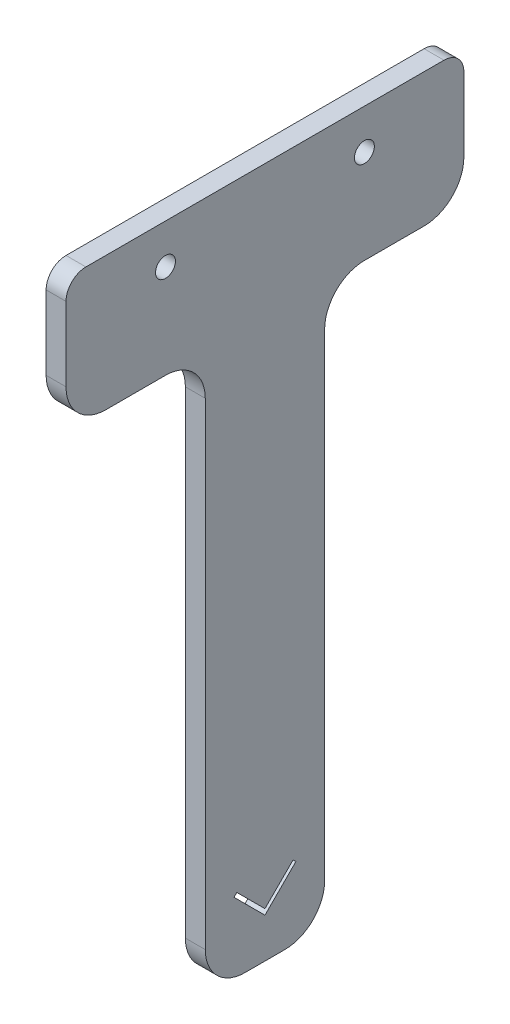
ISO-10303-21;
HEADER;
FILE_DESCRIPTION(('STEP AP214'),'2;1');
FILE_NAME('part.step','',(''),(''),'','','');
FILE_SCHEMA(('AUTOMOTIVE_DESIGN { 1 0 10303 214 1 1 1 1 }'));
ENDSEC;
DATA;
#1=APPLICATION_CONTEXT('core data for automotive mechanical design processes');
#2=APPLICATION_PROTOCOL_DEFINITION('international standard','automotive_design',2000,#1);
#3=PRODUCT_CONTEXT('',#1,'mechanical');
#4=PRODUCT('Part','Part','',(#3));
#5=PRODUCT_RELATED_PRODUCT_CATEGORY('part','',(#4));
#6=PRODUCT_DEFINITION_FORMATION('','',#4);
#7=PRODUCT_DEFINITION_CONTEXT('part definition',#1,'design');
#8=PRODUCT_DEFINITION('design','',#6,#7);
#9=PRODUCT_DEFINITION_SHAPE('','',#8);
#10=(LENGTH_UNIT() NAMED_UNIT(*) SI_UNIT(.MILLI.,.METRE.));
#11=(NAMED_UNIT(*) PLANE_ANGLE_UNIT() SI_UNIT($,.RADIAN.));
#12=(NAMED_UNIT(*) SI_UNIT($,.STERADIAN.) SOLID_ANGLE_UNIT());
#13=UNCERTAINTY_MEASURE_WITH_UNIT(LENGTH_MEASURE(1.E-05),#10,'distance_accuracy_value','');
#14=(GEOMETRIC_REPRESENTATION_CONTEXT(3) GLOBAL_UNCERTAINTY_ASSIGNED_CONTEXT((#13)) GLOBAL_UNIT_ASSIGNED_CONTEXT((#10,
#11,#12)) REPRESENTATION_CONTEXT('',''));
#15=CARTESIAN_POINT('',(0.,0.,0.));
#16=DIRECTION('',(0.,0.,1.));
#17=DIRECTION('',(1.,0.,0.));
#18=AXIS2_PLACEMENT_3D('',#15,#16,#17);
#19=CARTESIAN_POINT('',(6.35,-110.236,57.15));
#20=DIRECTION('',(0.,1.,0.));
#21=DIRECTION('',(0.,0.,1.));
#22=AXIS2_PLACEMENT_3D('',#19,#20,#21);
#23=PLANE('',#22);
#24=DIRECTION('',(0.,0.,-1.));
#25=VECTOR('',#24,1.);
#26=CARTESIAN_POINT('',(6.35,-110.236,57.15));
#27=LINE('',#26,#25);
#28=CARTESIAN_POINT('',(6.35,-110.236,6.34999999999992));
#29=VERTEX_POINT('',#28);
#30=CARTESIAN_POINT('',(6.35,-110.236,-6.34999999999991));
#31=VERTEX_POINT('',#30);
#32=EDGE_CURVE('E204',#29,#31,#27,.T.);
#33=ORIENTED_EDGE('',*,*,#32,.F.);
#34=DIRECTION('',(1.,0.,0.));
#35=VECTOR('',#34,1.);
#36=CARTESIAN_POINT('',(0.,-110.236,6.34999999999992));
#37=LINE('',#36,#35);
#38=CARTESIAN_POINT('',(0.,-110.236,6.34999999999992));
#39=VERTEX_POINT('',#38);
#40=EDGE_CURVE('E190',#39,#29,#37,.T.);
#41=ORIENTED_EDGE('',*,*,#40,.F.);
#42=DIRECTION('',(0.,0.,-1.));
#43=VECTOR('',#42,1.);
#44=CARTESIAN_POINT('',(0.,-110.236,57.15));
#45=LINE('',#44,#43);
#46=CARTESIAN_POINT('',(0.,-110.236,-6.34999999999991));
#47=VERTEX_POINT('',#46);
#48=EDGE_CURVE('E202',#39,#47,#45,.T.);
#49=ORIENTED_EDGE('',*,*,#48,.T.);
#50=DIRECTION('',(1.,0.,0.));
#51=VECTOR('',#50,1.);
#52=CARTESIAN_POINT('',(0.,-110.236,-6.34999999999991));
#53=LINE('',#52,#51);
#54=EDGE_CURVE('E382',#47,#31,#53,.T.);
#55=ORIENTED_EDGE('',*,*,#54,.T.);
#56=EDGE_LOOP('',(#33,#41,#49,#55));
#57=FACE_BOUND('',#56,.T.);
#58=ADVANCED_FACE('F38',(#57),#23,.F.);
#59=CARTESIAN_POINT('',(6.35,-103.886,63.5));
#60=DIRECTION('',(0.,0.,-1.));
#61=DIRECTION('',(-1.,0.,0.));
#62=AXIS2_PLACEMENT_3D('',#59,#60,#61);
#63=PLANE('',#62);
#64=DIRECTION('',(1.,0.,0.));
#65=VECTOR('',#64,1.);
#66=CARTESIAN_POINT('',(0.,80.2640000000001,63.5));
#67=LINE('',#66,#65);
#68=CARTESIAN_POINT('',(0.,80.2640000000001,63.5));
#69=VERTEX_POINT('',#68);
#70=CARTESIAN_POINT('',(6.35,80.2640000000001,63.5));
#71=VERTEX_POINT('',#70);
#72=EDGE_CURVE('E273',#69,#71,#67,.T.);
#73=ORIENTED_EDGE('',*,*,#72,.T.);
#74=DIRECTION('',(0.,-1.,0.));
#75=VECTOR('',#74,1.);
#76=CARTESIAN_POINT('',(6.35,-103.886,63.5));
#77=LINE('',#76,#75);
#78=CARTESIAN_POINT('',(6.35,103.886,63.5));
#79=VERTEX_POINT('',#78);
#80=EDGE_CURVE('E227',#79,#71,#77,.T.);
#81=ORIENTED_EDGE('',*,*,#80,.F.);
#82=DIRECTION('',(-1.,0.,0.));
#83=VECTOR('',#82,1.);
#84=CARTESIAN_POINT('',(6.35,103.886,63.5));
#85=LINE('',#84,#83);
#86=CARTESIAN_POINT('',(0.,103.886,63.5));
#87=VERTEX_POINT('',#86);
#88=EDGE_CURVE('E242',#79,#87,#85,.T.);
#89=ORIENTED_EDGE('',*,*,#88,.T.);
#90=DIRECTION('',(0.,-1.,0.));
#91=VECTOR('',#90,1.);
#92=CARTESIAN_POINT('',(0.,-103.886,63.5));
#93=LINE('',#92,#91);
#94=EDGE_CURVE('E238',#87,#69,#93,.T.);
#95=ORIENTED_EDGE('',*,*,#94,.T.);
#96=EDGE_LOOP('',(#73,#81,#89,#95));
#97=FACE_BOUND('',#96,.T.);
#98=ADVANCED_FACE('F271',(#97),#63,.F.);
#99=CARTESIAN_POINT('',(6.35,-103.886,-63.5));
#100=DIRECTION('',(0.,0.,1.));
#101=DIRECTION('',(1.,0.,0.));
#102=AXIS2_PLACEMENT_3D('',#99,#100,#101);
#103=PLANE('',#102);
#104=DIRECTION('',(0.,1.,0.));
#105=VECTOR('',#104,1.);
#106=CARTESIAN_POINT('',(6.35,-103.886,-63.5));
#107=LINE('',#106,#105);
#108=CARTESIAN_POINT('',(6.35,80.2640000000001,-63.5));
#109=VERTEX_POINT('',#108);
#110=CARTESIAN_POINT('',(6.35,103.886,-63.5));
#111=VERTEX_POINT('',#110);
#112=EDGE_CURVE('E285',#109,#111,#107,.T.);
#113=ORIENTED_EDGE('',*,*,#112,.F.);
#114=DIRECTION('',(1.,0.,0.));
#115=VECTOR('',#114,1.);
#116=CARTESIAN_POINT('',(0.,80.2640000000001,-63.5));
#117=LINE('',#116,#115);
#118=CARTESIAN_POINT('',(0.,80.2640000000001,-63.5));
#119=VERTEX_POINT('',#118);
#120=EDGE_CURVE('E367',#119,#109,#117,.T.);
#121=ORIENTED_EDGE('',*,*,#120,.F.);
#122=DIRECTION('',(0.,1.,0.));
#123=VECTOR('',#122,1.);
#124=CARTESIAN_POINT('',(0.,-103.886,-63.5));
#125=LINE('',#124,#123);
#126=CARTESIAN_POINT('',(0.,103.886,-63.5));
#127=VERTEX_POINT('',#126);
#128=EDGE_CURVE('E216',#119,#127,#125,.T.);
#129=ORIENTED_EDGE('',*,*,#128,.T.);
#130=DIRECTION('',(-1.,0.,0.));
#131=VECTOR('',#130,1.);
#132=CARTESIAN_POINT('',(6.35,103.886,-63.5));
#133=LINE('',#132,#131);
#134=EDGE_CURVE('E11',#111,#127,#133,.T.);
#135=ORIENTED_EDGE('',*,*,#134,.F.);
#136=EDGE_LOOP('',(#113,#121,#129,#135));
#137=FACE_BOUND('',#136,.T.);
#138=ADVANCED_FACE('F487',(#137),#103,.F.);
#139=CARTESIAN_POINT('',(6.35,103.886,-57.15));
#140=DIRECTION('',(-1.,0.,0.));
#141=DIRECTION('',(0.,0.,1.));
#142=AXIS2_PLACEMENT_3D('',#139,#140,#141);
#143=CYLINDRICAL_SURFACE('',#142,6.35);
#144=CARTESIAN_POINT('',(0.,103.886,-57.15));
#145=DIRECTION('',(1.,0.,0.));
#146=DIRECTION('',(0.,0.,-1.));
#147=AXIS2_PLACEMENT_3D('',#144,#145,#146);
#148=CIRCLE('',#147,6.35);
#149=CARTESIAN_POINT('',(0.,110.236,-57.15));
#150=VERTEX_POINT('',#149);
#151=EDGE_CURVE('E221',#127,#150,#148,.T.);
#152=ORIENTED_EDGE('',*,*,#151,.T.);
#153=DIRECTION('',(-1.,0.,0.));
#154=VECTOR('',#153,1.);
#155=CARTESIAN_POINT('',(6.35,110.236,-57.15));
#156=LINE('',#155,#154);
#157=CARTESIAN_POINT('',(6.35,110.236,-57.15));
#158=VERTEX_POINT('',#157);
#159=EDGE_CURVE('E46',#158,#150,#156,.T.);
#160=ORIENTED_EDGE('',*,*,#159,.F.);
#161=CARTESIAN_POINT('',(6.35,103.886,-57.15));
#162=DIRECTION('',(1.,0.,0.));
#163=DIRECTION('',(0.,0.,-1.));
#164=AXIS2_PLACEMENT_3D('',#161,#162,#163);
#165=CIRCLE('',#164,6.35);
#166=EDGE_CURVE('E280',#111,#158,#165,.T.);
#167=ORIENTED_EDGE('',*,*,#166,.F.);
#168=ORIENTED_EDGE('',*,*,#134,.T.);
#169=EDGE_LOOP('',(#152,#160,#167,#168));
#170=FACE_BOUND('',#169,.T.);
#171=ADVANCED_FACE('F492',(#170),#143,.T.);
#172=CARTESIAN_POINT('',(6.35,110.236,57.15));
#173=DIRECTION('',(0.,-1.,0.));
#174=DIRECTION('',(0.,0.,-1.));
#175=AXIS2_PLACEMENT_3D('',#172,#173,#174);
#176=PLANE('',#175);
#177=DIRECTION('',(0.,0.,1.));
#178=VECTOR('',#177,1.);
#179=CARTESIAN_POINT('',(0.,110.236,57.15));
#180=LINE('',#179,#178);
#181=CARTESIAN_POINT('',(0.,110.236,57.15));
#182=VERTEX_POINT('',#181);
#183=EDGE_CURVE('E232',#150,#182,#180,.T.);
#184=ORIENTED_EDGE('',*,*,#183,.T.);
#185=DIRECTION('',(-1.,0.,0.));
#186=VECTOR('',#185,1.);
#187=CARTESIAN_POINT('',(6.35,110.236,57.15));
#188=LINE('',#187,#186);
#189=CARTESIAN_POINT('',(6.35,110.236,57.15));
#190=VERTEX_POINT('',#189);
#191=EDGE_CURVE('E246',#190,#182,#188,.T.);
#192=ORIENTED_EDGE('',*,*,#191,.F.);
#193=DIRECTION('',(0.,0.,1.));
#194=VECTOR('',#193,1.);
#195=CARTESIAN_POINT('',(6.35,110.236,57.15));
#196=LINE('',#195,#194);
#197=EDGE_CURVE('E257',#158,#190,#196,.T.);
#198=ORIENTED_EDGE('',*,*,#197,.F.);
#199=ORIENTED_EDGE('',*,*,#159,.T.);
#200=EDGE_LOOP('',(#184,#192,#198,#199));
#201=FACE_BOUND('',#200,.T.);
#202=ADVANCED_FACE('F255',(#201),#176,.F.);
#203=CARTESIAN_POINT('',(6.35,103.886,57.15));
#204=DIRECTION('',(-1.,0.,0.));
#205=DIRECTION('',(0.,0.,1.));
#206=AXIS2_PLACEMENT_3D('',#203,#204,#205);
#207=CYLINDRICAL_SURFACE('',#206,6.35);
#208=CARTESIAN_POINT('',(0.,103.886,57.15));
#209=DIRECTION('',(1.,0.,0.));
#210=DIRECTION('',(0.,0.,1.));
#211=AXIS2_PLACEMENT_3D('',#208,#209,#210);
#212=CIRCLE('',#211,6.35);
#213=EDGE_CURVE('E235',#182,#87,#212,.T.);
#214=ORIENTED_EDGE('',*,*,#213,.T.);
#215=ORIENTED_EDGE('',*,*,#88,.F.);
#216=CARTESIAN_POINT('',(6.35,103.886,57.15));
#217=DIRECTION('',(1.,0.,0.));
#218=DIRECTION('',(0.,0.,1.));
#219=AXIS2_PLACEMENT_3D('',#216,#217,#218);
#220=CIRCLE('',#219,6.35);
#221=EDGE_CURVE('E277',#190,#79,#220,.T.);
#222=ORIENTED_EDGE('',*,*,#221,.F.);
#223=ORIENTED_EDGE('',*,*,#191,.T.);
#224=EDGE_LOOP('',(#214,#215,#222,#223));
#225=FACE_BOUND('',#224,.T.);
#226=ADVANCED_FACE('F266',(#225),#207,.T.);
#227=CARTESIAN_POINT('',(6.35,-103.886,57.15));
#228=DIRECTION('',(-1.,0.,0.));
#229=DIRECTION('',(0.,0.,1.));
#230=AXIS2_PLACEMENT_3D('',#227,#228,#229);
#231=PLANE('',#230);
#232=CARTESIAN_POINT('',(6.35,97.536,31.75));
#233=DIRECTION('',(-1.,0.,0.));
#234=DIRECTION('',(0.,0.,1.));
#235=AXIS2_PLACEMENT_3D('',#232,#233,#234);
#236=CIRCLE('',#235,3.175);
#237=CARTESIAN_POINT('',(6.35,97.536,34.925));
#238=VERTEX_POINT('',#237);
#239=EDGE_CURVE('E351',#238,#238,#236,.T.);
#240=ORIENTED_EDGE('',*,*,#239,.T.);
#241=EDGE_LOOP('',(#240));
#242=FACE_BOUND('',#241,.T.);
#243=CARTESIAN_POINT('',(6.35,97.536,-31.75));
#244=DIRECTION('',(-1.,0.,0.));
#245=DIRECTION('',(0.,0.,1.));
#246=AXIS2_PLACEMENT_3D('',#243,#244,#245);
#247=CIRCLE('',#246,3.175);
#248=CARTESIAN_POINT('',(6.35,97.536,-28.575));
#249=VERTEX_POINT('',#248);
#250=EDGE_CURVE('E355',#249,#249,#247,.T.);
#251=ORIENTED_EDGE('',*,*,#250,.T.);
#252=EDGE_LOOP('',(#251));
#253=FACE_BOUND('',#252,.T.);
#254=DIRECTION('',(0.,0.707106781186548,0.707106781186547));
#255=VECTOR('',#254,1.);
#256=CARTESIAN_POINT('',(6.35,-95.7399487757862,0.));
#257=LINE('',#256,#255);
#258=CARTESIAN_POINT('',(6.35,-95.7399487757862,0.));
#259=VERTEX_POINT('',#258);
#260=CARTESIAN_POINT('',(6.35,-86.759692654717,8.98025612106915));
#261=VERTEX_POINT('',#260);
#262=EDGE_CURVE('E324',#259,#261,#257,.T.);
#263=ORIENTED_EDGE('',*,*,#262,.F.);
#264=DIRECTION('',(0.,-0.707106781186546,0.707106781186549));
#265=VECTOR('',#264,1.);
#266=CARTESIAN_POINT('',(6.35,-86.759692654717,-8.98025612106917));
#267=LINE('',#266,#265);
#268=CARTESIAN_POINT('',(6.35,-86.759692654717,-8.98025612106917));
#269=VERTEX_POINT('',#268);
#270=EDGE_CURVE('E328',#269,#259,#267,.T.);
#271=ORIENTED_EDGE('',*,*,#270,.F.);
#272=DIRECTION('',(0.,0.70710678118655,0.707106781186545));
#273=VECTOR('',#272,1.);
#274=CARTESIAN_POINT('',(6.35,-87.6577182668239,-9.87828173317606));
#275=LINE('',#274,#273);
#276=CARTESIAN_POINT('',(6.35,-87.6577182668239,-9.87828173317606));
#277=VERTEX_POINT('',#276);
#278=EDGE_CURVE('E295',#277,#269,#275,.T.);
#279=ORIENTED_EDGE('',*,*,#278,.F.);
#280=DIRECTION('',(0.,0.707106781186547,-0.707106781186548));
#281=VECTOR('',#280,1.);
#282=CARTESIAN_POINT('',(6.35,-97.536,0.));
#283=LINE('',#282,#281);
#284=CARTESIAN_POINT('',(6.35,-97.536,0.));
#285=VERTEX_POINT('',#284);
#286=EDGE_CURVE('E312',#285,#277,#283,.T.);
#287=ORIENTED_EDGE('',*,*,#286,.F.);
#288=DIRECTION('',(0.,-0.707106781186547,-0.707106781186548));
#289=VECTOR('',#288,1.);
#290=CARTESIAN_POINT('',(6.35,-87.6577182668239,9.87828173317606));
#291=LINE('',#290,#289);
#292=CARTESIAN_POINT('',(6.35,-87.6577182668239,9.87828173317606));
#293=VERTEX_POINT('',#292);
#294=EDGE_CURVE('E316',#293,#285,#291,.T.);
#295=ORIENTED_EDGE('',*,*,#294,.F.);
#296=DIRECTION('',(0.,-0.707106781186556,0.707106781186539));
#297=VECTOR('',#296,1.);
#298=CARTESIAN_POINT('',(6.35,-86.759692654717,8.98025612106915));
#299=LINE('',#298,#297);
#300=EDGE_CURVE('E320',#261,#293,#299,.T.);
#301=ORIENTED_EDGE('',*,*,#300,.F.);
#302=EDGE_LOOP('',(#263,#271,#279,#287,#295,#301));
#303=FACE_BOUND('',#302,.T.);
#304=ORIENTED_EDGE('',*,*,#80,.T.);
#305=CARTESIAN_POINT('',(6.35,80.264,50.8));
#306=DIRECTION('',(-1.,0.,0.));
#307=DIRECTION('',(0.,0.,-1.));
#308=AXIS2_PLACEMENT_3D('',#305,#306,#307);
#309=CIRCLE('',#308,12.7);
#310=CARTESIAN_POINT('',(6.35,67.564,50.7999999999999));
#311=VERTEX_POINT('',#310);
#312=EDGE_CURVE('E196',#311,#71,#309,.T.);
#313=ORIENTED_EDGE('',*,*,#312,.F.);
#314=DIRECTION('',(0.,0.,1.));
#315=VECTOR('',#314,1.);
#316=CARTESIAN_POINT('',(6.35,67.564,31.7500000000001));
#317=LINE('',#316,#315);
#318=CARTESIAN_POINT('',(6.35,67.564,31.7500000000001));
#319=VERTEX_POINT('',#318);
#320=EDGE_CURVE('E435',#319,#311,#317,.T.);
#321=ORIENTED_EDGE('',*,*,#320,.F.);
#322=CARTESIAN_POINT('',(6.35,54.864,31.75));
#323=DIRECTION('',(1.,0.,0.));
#324=DIRECTION('',(0.,0.,-1.));
#325=AXIS2_PLACEMENT_3D('',#322,#323,#324);
#326=CIRCLE('',#325,12.7);
#327=CARTESIAN_POINT('',(6.35,54.8639999999999,19.05));
#328=VERTEX_POINT('',#327);
#329=EDGE_CURVE('E439',#328,#319,#326,.T.);
#330=ORIENTED_EDGE('',*,*,#329,.F.);
#331=DIRECTION('',(0.,1.,0.));
#332=VECTOR('',#331,1.);
#333=CARTESIAN_POINT('',(6.35,-97.5359999999999,19.05));
#334=LINE('',#333,#332);
#335=CARTESIAN_POINT('',(6.35,-97.5359999999999,19.05));
#336=VERTEX_POINT('',#335);
#337=EDGE_CURVE('E443',#336,#328,#334,.T.);
#338=ORIENTED_EDGE('',*,*,#337,.F.);
#339=CARTESIAN_POINT('',(6.35,-97.536,6.35));
#340=DIRECTION('',(-1.,0.,0.));
#341=DIRECTION('',(0.,0.,-1.));
#342=AXIS2_PLACEMENT_3D('',#339,#340,#341);
#343=CIRCLE('',#342,12.7);
#344=EDGE_CURVE('E385',#29,#336,#343,.T.);
#345=ORIENTED_EDGE('',*,*,#344,.F.);
#346=ORIENTED_EDGE('',*,*,#32,.T.);
#347=CARTESIAN_POINT('',(6.35,-97.536,-6.35));
#348=DIRECTION('',(-1.,0.,0.));
#349=DIRECTION('',(0.,0.,-1.));
#350=AXIS2_PLACEMENT_3D('',#347,#348,#349);
#351=CIRCLE('',#350,12.7);
#352=CARTESIAN_POINT('',(6.35,-97.536,-19.05));
#353=VERTEX_POINT('',#352);
#354=EDGE_CURVE('E386',#353,#31,#351,.T.);
#355=ORIENTED_EDGE('',*,*,#354,.F.);
#356=DIRECTION('',(0.,-1.,0.));
#357=VECTOR('',#356,1.);
#358=CARTESIAN_POINT('',(6.35,-97.5359999999999,-19.05));
#359=LINE('',#358,#357);
#360=CARTESIAN_POINT('',(6.35,54.8639999999999,-19.05));
#361=VERTEX_POINT('',#360);
#362=EDGE_CURVE('E390',#361,#353,#359,.T.);
#363=ORIENTED_EDGE('',*,*,#362,.F.);
#364=CARTESIAN_POINT('',(6.35,54.864,-31.75));
#365=DIRECTION('',(1.,0.,0.));
#366=DIRECTION('',(0.,0.,1.));
#367=AXIS2_PLACEMENT_3D('',#364,#365,#366);
#368=CIRCLE('',#367,12.7);
#369=CARTESIAN_POINT('',(6.35,67.564,-31.7500000000001));
#370=VERTEX_POINT('',#369);
#371=EDGE_CURVE('E394',#370,#361,#368,.T.);
#372=ORIENTED_EDGE('',*,*,#371,.F.);
#373=DIRECTION('',(0.,0.,1.));
#374=VECTOR('',#373,1.);
#375=CARTESIAN_POINT('',(6.35,67.564,-31.7500000000001));
#376=LINE('',#375,#374);
#377=CARTESIAN_POINT('',(6.35,67.564,-50.7999999999999));
#378=VERTEX_POINT('',#377);
#379=EDGE_CURVE('E398',#378,#370,#376,.T.);
#380=ORIENTED_EDGE('',*,*,#379,.F.);
#381=CARTESIAN_POINT('',(6.35,80.264,-50.8));
#382=DIRECTION('',(-1.,0.,0.));
#383=DIRECTION('',(0.,0.,1.));
#384=AXIS2_PLACEMENT_3D('',#381,#382,#383);
#385=CIRCLE('',#384,12.7);
#386=EDGE_CURVE('E402',#109,#378,#385,.T.);
#387=ORIENTED_EDGE('',*,*,#386,.F.);
#388=ORIENTED_EDGE('',*,*,#112,.T.);
#389=ORIENTED_EDGE('',*,*,#166,.T.);
#390=ORIENTED_EDGE('',*,*,#197,.T.);
#391=ORIENTED_EDGE('',*,*,#221,.T.);
#392=EDGE_LOOP('',(#304,#313,#321,#330,#338,#345,#346,#355,#363,#372,#380,#387,#388,#389,#390,#391));
#393=FACE_BOUND('',#392,.T.);
#394=ADVANCED_FACE('F471',(#242,#253,#303,#393),#231,.F.);
#395=CARTESIAN_POINT('',(0.,-103.886,57.15));
#396=DIRECTION('',(-1.,0.,0.));
#397=DIRECTION('',(0.,0.,1.));
#398=AXIS2_PLACEMENT_3D('',#395,#396,#397);
#399=PLANE('',#398);
#400=CARTESIAN_POINT('',(0.,80.264,50.8));
#401=DIRECTION('',(-1.,0.,0.));
#402=DIRECTION('',(0.,0.,-1.));
#403=AXIS2_PLACEMENT_3D('',#400,#401,#402);
#404=CIRCLE('',#403,12.7);
#405=CARTESIAN_POINT('',(0.,67.564,50.7999999999999));
#406=VERTEX_POINT('',#405);
#407=EDGE_CURVE('E206',#406,#69,#404,.T.);
#408=ORIENTED_EDGE('',*,*,#407,.T.);
#409=ORIENTED_EDGE('',*,*,#94,.F.);
#410=ORIENTED_EDGE('',*,*,#213,.F.);
#411=ORIENTED_EDGE('',*,*,#183,.F.);
#412=ORIENTED_EDGE('',*,*,#151,.F.);
#413=ORIENTED_EDGE('',*,*,#128,.F.);
#414=CARTESIAN_POINT('',(0.,80.264,-50.8));
#415=DIRECTION('',(-1.,0.,0.));
#416=DIRECTION('',(0.,0.,1.));
#417=AXIS2_PLACEMENT_3D('',#414,#415,#416);
#418=CIRCLE('',#417,12.7);
#419=CARTESIAN_POINT('',(0.,67.564,-50.7999999999999));
#420=VERTEX_POINT('',#419);
#421=EDGE_CURVE('E389',#119,#420,#418,.T.);
#422=ORIENTED_EDGE('',*,*,#421,.T.);
#423=DIRECTION('',(0.,0.,1.));
#424=VECTOR('',#423,1.);
#425=CARTESIAN_POINT('',(0.,67.564,-31.7500000000001));
#426=LINE('',#425,#424);
#427=CARTESIAN_POINT('',(0.,67.564,-31.7500000000001));
#428=VERTEX_POINT('',#427);
#429=EDGE_CURVE('E61',#420,#428,#426,.T.);
#430=ORIENTED_EDGE('',*,*,#429,.T.);
#431=CARTESIAN_POINT('',(0.,54.864,-31.75));
#432=DIRECTION('',(1.,0.,0.));
#433=DIRECTION('',(0.,0.,1.));
#434=AXIS2_PLACEMENT_3D('',#431,#432,#433);
#435=CIRCLE('',#434,12.7);
#436=CARTESIAN_POINT('',(0.,54.8639999999999,-19.05));
#437=VERTEX_POINT('',#436);
#438=EDGE_CURVE('E411',#428,#437,#435,.T.);
#439=ORIENTED_EDGE('',*,*,#438,.T.);
#440=DIRECTION('',(0.,-1.,0.));
#441=VECTOR('',#440,1.);
#442=CARTESIAN_POINT('',(0.,-97.5359999999999,-19.05));
#443=LINE('',#442,#441);
#444=CARTESIAN_POINT('',(0.,-97.536,-19.05));
#445=VERTEX_POINT('',#444);
#446=EDGE_CURVE('E408',#437,#445,#443,.T.);
#447=ORIENTED_EDGE('',*,*,#446,.T.);
#448=CARTESIAN_POINT('',(0.,-97.536,-6.35));
#449=DIRECTION('',(-1.,0.,0.));
#450=DIRECTION('',(0.,0.,-1.));
#451=AXIS2_PLACEMENT_3D('',#448,#449,#450);
#452=CIRCLE('',#451,12.7);
#453=EDGE_CURVE('E214',#445,#47,#452,.T.);
#454=ORIENTED_EDGE('',*,*,#453,.T.);
#455=ORIENTED_EDGE('',*,*,#48,.F.);
#456=CARTESIAN_POINT('',(0.,-97.536,6.35));
#457=DIRECTION('',(-1.,0.,0.));
#458=DIRECTION('',(0.,0.,-1.));
#459=AXIS2_PLACEMENT_3D('',#456,#457,#458);
#460=CIRCLE('',#459,12.7);
#461=CARTESIAN_POINT('',(0.,-97.536,19.05));
#462=VERTEX_POINT('',#461);
#463=EDGE_CURVE('E186',#39,#462,#460,.T.);
#464=ORIENTED_EDGE('',*,*,#463,.T.);
#465=DIRECTION('',(0.,1.,0.));
#466=VECTOR('',#465,1.);
#467=CARTESIAN_POINT('',(0.,-97.5359999999999,19.05));
#468=LINE('',#467,#466);
#469=CARTESIAN_POINT('',(0.,54.8639999999999,19.05));
#470=VERTEX_POINT('',#469);
#471=EDGE_CURVE('E53',#462,#470,#468,.T.);
#472=ORIENTED_EDGE('',*,*,#471,.T.);
#473=CARTESIAN_POINT('',(0.,54.864,31.75));
#474=DIRECTION('',(1.,0.,0.));
#475=DIRECTION('',(0.,0.,-1.));
#476=AXIS2_PLACEMENT_3D('',#473,#474,#475);
#477=CIRCLE('',#476,12.7);
#478=CARTESIAN_POINT('',(0.,67.564,31.7500000000001));
#479=VERTEX_POINT('',#478);
#480=EDGE_CURVE('E455',#470,#479,#477,.T.);
#481=ORIENTED_EDGE('',*,*,#480,.T.);
#482=DIRECTION('',(0.,0.,1.));
#483=VECTOR('',#482,1.);
#484=CARTESIAN_POINT('',(0.,67.564,31.7500000000001));
#485=LINE('',#484,#483);
#486=EDGE_CURVE('E451',#479,#406,#485,.T.);
#487=ORIENTED_EDGE('',*,*,#486,.T.);
#488=EDGE_LOOP('',(#408,#409,#410,#411,#412,#413,#422,#430,#439,#447,#454,#455,#464,#472,#481,#487));
#489=FACE_BOUND('',#488,.T.);
#490=CARTESIAN_POINT('',(0.,97.536,31.75));
#491=DIRECTION('',(1.,0.,0.));
#492=DIRECTION('',(0.,0.,-1.));
#493=AXIS2_PLACEMENT_3D('',#490,#491,#492);
#494=CIRCLE('',#493,3.175);
#495=CARTESIAN_POINT('',(0.,97.536,28.575));
#496=VERTEX_POINT('',#495);
#497=EDGE_CURVE('E359',#496,#496,#494,.T.);
#498=ORIENTED_EDGE('',*,*,#497,.T.);
#499=EDGE_LOOP('',(#498));
#500=FACE_BOUND('',#499,.T.);
#501=CARTESIAN_POINT('',(0.,97.536,-31.75));
#502=DIRECTION('',(1.,0.,0.));
#503=DIRECTION('',(0.,0.,-1.));
#504=AXIS2_PLACEMENT_3D('',#501,#502,#503);
#505=CIRCLE('',#504,3.175);
#506=CARTESIAN_POINT('',(0.,97.536,-34.925));
#507=VERTEX_POINT('',#506);
#508=EDGE_CURVE('E360',#507,#507,#505,.T.);
#509=ORIENTED_EDGE('',*,*,#508,.T.);
#510=EDGE_LOOP('',(#509));
#511=FACE_BOUND('',#510,.T.);
#512=DIRECTION('',(0.,-0.707106781186546,0.707106781186549));
#513=VECTOR('',#512,1.);
#514=CARTESIAN_POINT('',(0.,-86.759692654717,-8.98025612106917));
#515=LINE('',#514,#513);
#516=CARTESIAN_POINT('',(0.,-86.759692654717,-8.98025612106917));
#517=VERTEX_POINT('',#516);
#518=CARTESIAN_POINT('',(0.,-95.7399487757862,0.));
#519=VERTEX_POINT('',#518);
#520=EDGE_CURVE('E331',#517,#519,#515,.T.);
#521=ORIENTED_EDGE('',*,*,#520,.T.);
#522=DIRECTION('',(0.,0.707106781186548,0.707106781186547));
#523=VECTOR('',#522,1.);
#524=CARTESIAN_POINT('',(0.,-95.7399487757862,0.));
#525=LINE('',#524,#523);
#526=CARTESIAN_POINT('',(0.,-86.759692654717,8.98025612106914));
#527=VERTEX_POINT('',#526);
#528=EDGE_CURVE('E217',#519,#527,#525,.T.);
#529=ORIENTED_EDGE('',*,*,#528,.T.);
#530=DIRECTION('',(0.,-0.707106781186556,0.707106781186539));
#531=VECTOR('',#530,1.);
#532=CARTESIAN_POINT('',(0.,-86.759692654717,8.98025612106915));
#533=LINE('',#532,#531);
#534=CARTESIAN_POINT('',(0.,-87.6577182668239,9.87828173317606));
#535=VERTEX_POINT('',#534);
#536=EDGE_CURVE('E347',#527,#535,#533,.T.);
#537=ORIENTED_EDGE('',*,*,#536,.T.);
#538=DIRECTION('',(0.,-0.707106781186547,-0.707106781186548));
#539=VECTOR('',#538,1.);
#540=CARTESIAN_POINT('',(0.,-87.6577182668239,9.87828173317606));
#541=LINE('',#540,#539);
#542=CARTESIAN_POINT('',(0.,-97.536,0.));
#543=VERTEX_POINT('',#542);
#544=EDGE_CURVE('E343',#535,#543,#541,.T.);
#545=ORIENTED_EDGE('',*,*,#544,.T.);
#546=DIRECTION('',(0.,0.707106781186547,-0.707106781186548));
#547=VECTOR('',#546,1.);
#548=CARTESIAN_POINT('',(0.,-97.536,0.));
#549=LINE('',#548,#547);
#550=CARTESIAN_POINT('',(0.,-87.6577182668239,-9.87828173317606));
#551=VERTEX_POINT('',#550);
#552=EDGE_CURVE('E339',#543,#551,#549,.T.);
#553=ORIENTED_EDGE('',*,*,#552,.T.);
#554=DIRECTION('',(0.,0.70710678118655,0.707106781186545));
#555=VECTOR('',#554,1.);
#556=CARTESIAN_POINT('',(0.,-87.6577182668239,-9.87828173317606));
#557=LINE('',#556,#555);
#558=EDGE_CURVE('E335',#551,#517,#557,.T.);
#559=ORIENTED_EDGE('',*,*,#558,.T.);
#560=EDGE_LOOP('',(#521,#529,#537,#545,#553,#559));
#561=FACE_BOUND('',#560,.T.);
#562=ADVANCED_FACE('F210',(#489,#500,#511,#561),#399,.T.);
#563=CARTESIAN_POINT('',(-0.00100000000000013,-86.759692654717,-8.98025612106917));
#564=DIRECTION('',(0.,0.707106781186549,0.707106781186546));
#565=DIRECTION('',(0.,-0.707106781186546,0.707106781186549));
#566=AXIS2_PLACEMENT_3D('',#563,#564,#565);
#567=PLANE('',#566);
#568=DIRECTION('',(1.,0.,0.));
#569=VECTOR('',#568,1.);
#570=CARTESIAN_POINT('',(-0.00100000000000013,-86.759692654717,-8.98025612106917));
#571=LINE('',#570,#569);
#572=EDGE_CURVE('E224',#517,#269,#571,.T.);
#573=ORIENTED_EDGE('',*,*,#572,.T.);
#574=ORIENTED_EDGE('',*,*,#270,.T.);
#575=DIRECTION('',(1.,0.,0.));
#576=VECTOR('',#575,1.);
#577=CARTESIAN_POINT('',(-0.00100000000000013,-95.7399487757862,0.));
#578=LINE('',#577,#576);
#579=EDGE_CURVE('E290',#519,#259,#578,.T.);
#580=ORIENTED_EDGE('',*,*,#579,.F.);
#581=ORIENTED_EDGE('',*,*,#520,.F.);
#582=EDGE_LOOP('',(#573,#574,#580,#581));
#583=FACE_BOUND('',#582,.T.);
#584=ADVANCED_FACE('F551',(#583),#567,.F.);
#585=CARTESIAN_POINT('',(-0.00100000000000013,-87.6577182668239,-9.87828173317606));
#586=DIRECTION('',(0.,0.707106781186545,-0.70710678118655));
#587=DIRECTION('',(0.,0.70710678118655,0.707106781186545));
#588=AXIS2_PLACEMENT_3D('',#585,#586,#587);
#589=PLANE('',#588);
#590=DIRECTION('',(1.,0.,0.));
#591=VECTOR('',#590,1.);
#592=CARTESIAN_POINT('',(-0.00100000000000013,-87.6577182668239,-9.87828173317606));
#593=LINE('',#592,#591);
#594=EDGE_CURVE('E304',#551,#277,#593,.T.);
#595=ORIENTED_EDGE('',*,*,#594,.T.);
#596=ORIENTED_EDGE('',*,*,#278,.T.);
#597=ORIENTED_EDGE('',*,*,#572,.F.);
#598=ORIENTED_EDGE('',*,*,#558,.F.);
#599=EDGE_LOOP('',(#595,#596,#597,#598));
#600=FACE_BOUND('',#599,.T.);
#601=ADVANCED_FACE('F547',(#600),#589,.F.);
#602=CARTESIAN_POINT('',(-0.00100000000000013,-97.536,0.));
#603=DIRECTION('',(0.,-0.707106781186548,-0.707106781186547));
#604=DIRECTION('',(0.,0.707106781186547,-0.707106781186548));
#605=AXIS2_PLACEMENT_3D('',#602,#603,#604);
#606=PLANE('',#605);
#607=DIRECTION('',(1.,0.,0.));
#608=VECTOR('',#607,1.);
#609=CARTESIAN_POINT('',(-0.00100000000000013,-97.536,0.));
#610=LINE('',#609,#608);
#611=EDGE_CURVE('E301',#543,#285,#610,.T.);
#612=ORIENTED_EDGE('',*,*,#611,.T.);
#613=ORIENTED_EDGE('',*,*,#286,.T.);
#614=ORIENTED_EDGE('',*,*,#594,.F.);
#615=ORIENTED_EDGE('',*,*,#552,.F.);
#616=EDGE_LOOP('',(#612,#613,#614,#615));
#617=FACE_BOUND('',#616,.T.);
#618=ADVANCED_FACE('F550',(#617),#606,.F.);
#619=CARTESIAN_POINT('',(-0.00100000000000013,-87.6577182668239,9.87828173317606));
#620=DIRECTION('',(0.,-0.707106781186548,0.707106781186547));
#621=DIRECTION('',(0.,-0.707106781186547,-0.707106781186548));
#622=AXIS2_PLACEMENT_3D('',#619,#620,#621);
#623=PLANE('',#622);
#624=DIRECTION('',(1.,0.,0.));
#625=VECTOR('',#624,1.);
#626=CARTESIAN_POINT('',(-0.00100000000000013,-87.6577182668239,9.87828173317606));
#627=LINE('',#626,#625);
#628=EDGE_CURVE('E298',#535,#293,#627,.T.);
#629=ORIENTED_EDGE('',*,*,#628,.T.);
#630=ORIENTED_EDGE('',*,*,#294,.T.);
#631=ORIENTED_EDGE('',*,*,#611,.F.);
#632=ORIENTED_EDGE('',*,*,#544,.F.);
#633=EDGE_LOOP('',(#629,#630,#631,#632));
#634=FACE_BOUND('',#633,.T.);
#635=ADVANCED_FACE('F555',(#634),#623,.F.);
#636=CARTESIAN_POINT('',(-0.00100000000000013,-86.759692654717,8.98025612106915));
#637=DIRECTION('',(0.,0.707106781186539,0.707106781186556));
#638=DIRECTION('',(0.,-0.707106781186556,0.707106781186539));
#639=AXIS2_PLACEMENT_3D('',#636,#637,#638);
#640=PLANE('',#639);
#641=DIRECTION('',(1.,0.,0.));
#642=VECTOR('',#641,1.);
#643=CARTESIAN_POINT('',(-0.00100000000000013,-86.759692654717,8.98025612106915));
#644=LINE('',#643,#642);
#645=EDGE_CURVE('E294',#527,#261,#644,.T.);
#646=ORIENTED_EDGE('',*,*,#645,.T.);
#647=ORIENTED_EDGE('',*,*,#300,.T.);
#648=ORIENTED_EDGE('',*,*,#628,.F.);
#649=ORIENTED_EDGE('',*,*,#536,.F.);
#650=EDGE_LOOP('',(#646,#647,#648,#649));
#651=FACE_BOUND('',#650,.T.);
#652=ADVANCED_FACE('F559',(#651),#640,.F.);
#653=CARTESIAN_POINT('',(-0.00100000000000013,-95.7399487757862,0.));
#654=DIRECTION('',(0.,0.707106781186547,-0.707106781186548));
#655=DIRECTION('',(0.,0.707106781186548,0.707106781186547));
#656=AXIS2_PLACEMENT_3D('',#653,#654,#655);
#657=PLANE('',#656);
#658=ORIENTED_EDGE('',*,*,#579,.T.);
#659=ORIENTED_EDGE('',*,*,#262,.T.);
#660=ORIENTED_EDGE('',*,*,#645,.F.);
#661=ORIENTED_EDGE('',*,*,#528,.F.);
#662=EDGE_LOOP('',(#658,#659,#660,#661));
#663=FACE_BOUND('',#662,.T.);
#664=ADVANCED_FACE('F545',(#663),#657,.F.);
#665=CARTESIAN_POINT('',(0.,97.536,-31.75));
#666=DIRECTION('',(1.,0.,0.));
#667=DIRECTION('',(0.,0.,-1.));
#668=AXIS2_PLACEMENT_3D('',#665,#666,#667);
#669=CYLINDRICAL_SURFACE('',#668,3.175);
#670=ORIENTED_EDGE('',*,*,#508,.F.);
#671=EDGE_LOOP('',(#670));
#672=FACE_BOUND('',#671,.T.);
#673=ORIENTED_EDGE('',*,*,#250,.F.);
#674=EDGE_LOOP('',(#673));
#675=FACE_BOUND('',#674,.T.);
#676=ADVANCED_FACE('F533',(#672,#675),#669,.F.);
#677=CARTESIAN_POINT('',(0.,97.536,31.75));
#678=DIRECTION('',(1.,0.,0.));
#679=DIRECTION('',(0.,0.,-1.));
#680=AXIS2_PLACEMENT_3D('',#677,#678,#679);
#681=CYLINDRICAL_SURFACE('',#680,3.175);
#682=ORIENTED_EDGE('',*,*,#497,.F.);
#683=EDGE_LOOP('',(#682));
#684=FACE_BOUND('',#683,.T.);
#685=ORIENTED_EDGE('',*,*,#239,.F.);
#686=EDGE_LOOP('',(#685));
#687=FACE_BOUND('',#686,.T.);
#688=ADVANCED_FACE('F525',(#684,#687),#681,.F.);
#689=CARTESIAN_POINT('',(0.,-97.536,-6.35));
#690=DIRECTION('',(1.,0.,0.));
#691=DIRECTION('',(0.,0.,-1.));
#692=AXIS2_PLACEMENT_3D('',#689,#690,#691);
#693=CYLINDRICAL_SURFACE('',#692,12.7);
#694=ORIENTED_EDGE('',*,*,#354,.T.);
#695=ORIENTED_EDGE('',*,*,#54,.F.);
#696=ORIENTED_EDGE('',*,*,#453,.F.);
#697=DIRECTION('',(1.,0.,0.));
#698=VECTOR('',#697,1.);
#699=CARTESIAN_POINT('',(0.,-97.536,-19.05));
#700=LINE('',#699,#698);
#701=EDGE_CURVE('E379',#445,#353,#700,.T.);
#702=ORIENTED_EDGE('',*,*,#701,.T.);
#703=EDGE_LOOP('',(#694,#695,#696,#702));
#704=FACE_BOUND('',#703,.T.);
#705=ADVANCED_FACE('F523',(#704),#693,.T.);
#706=CARTESIAN_POINT('',(0.,-97.5359999999999,-19.05));
#707=DIRECTION('',(0.,0.,1.));
#708=DIRECTION('',(0.,-1.,0.));
#709=AXIS2_PLACEMENT_3D('',#706,#707,#708);
#710=PLANE('',#709);
#711=ORIENTED_EDGE('',*,*,#362,.T.);
#712=ORIENTED_EDGE('',*,*,#701,.F.);
#713=ORIENTED_EDGE('',*,*,#446,.F.);
#714=DIRECTION('',(1.,0.,0.));
#715=VECTOR('',#714,1.);
#716=CARTESIAN_POINT('',(0.,54.8639999999999,-19.05));
#717=LINE('',#716,#715);
#718=EDGE_CURVE('E376',#437,#361,#717,.T.);
#719=ORIENTED_EDGE('',*,*,#718,.T.);
#720=EDGE_LOOP('',(#711,#712,#713,#719));
#721=FACE_BOUND('',#720,.T.);
#722=ADVANCED_FACE('F521',(#721),#710,.F.);
#723=CARTESIAN_POINT('',(0.,54.864,-31.75));
#724=DIRECTION('',(1.,0.,0.));
#725=DIRECTION('',(0.,0.,-1.));
#726=AXIS2_PLACEMENT_3D('',#723,#724,#725);
#727=CYLINDRICAL_SURFACE('',#726,12.7);
#728=ORIENTED_EDGE('',*,*,#371,.T.);
#729=ORIENTED_EDGE('',*,*,#718,.F.);
#730=ORIENTED_EDGE('',*,*,#438,.F.);
#731=DIRECTION('',(1.,0.,0.));
#732=VECTOR('',#731,1.);
#733=CARTESIAN_POINT('',(0.,67.564,-31.7500000000001));
#734=LINE('',#733,#732);
#735=EDGE_CURVE('E373',#428,#370,#734,.T.);
#736=ORIENTED_EDGE('',*,*,#735,.T.);
#737=EDGE_LOOP('',(#728,#729,#730,#736));
#738=FACE_BOUND('',#737,.T.);
#739=ADVANCED_FACE('F518',(#738),#727,.F.);
#740=CARTESIAN_POINT('',(0.,67.564,-31.7500000000001));
#741=DIRECTION('',(0.,1.,0.));
#742=DIRECTION('',(0.,0.,1.));
#743=AXIS2_PLACEMENT_3D('',#740,#741,#742);
#744=PLANE('',#743);
#745=ORIENTED_EDGE('',*,*,#379,.T.);
#746=ORIENTED_EDGE('',*,*,#735,.F.);
#747=ORIENTED_EDGE('',*,*,#429,.F.);
#748=DIRECTION('',(1.,0.,0.));
#749=VECTOR('',#748,1.);
#750=CARTESIAN_POINT('',(0.,67.564,-50.7999999999999));
#751=LINE('',#750,#749);
#752=EDGE_CURVE('E370',#420,#378,#751,.T.);
#753=ORIENTED_EDGE('',*,*,#752,.T.);
#754=EDGE_LOOP('',(#745,#746,#747,#753));
#755=FACE_BOUND('',#754,.T.);
#756=ADVANCED_FACE('F512',(#755),#744,.F.);
#757=CARTESIAN_POINT('',(0.,80.264,-50.8));
#758=DIRECTION('',(1.,0.,0.));
#759=DIRECTION('',(0.,0.,-1.));
#760=AXIS2_PLACEMENT_3D('',#757,#758,#759);
#761=CYLINDRICAL_SURFACE('',#760,12.7);
#762=ORIENTED_EDGE('',*,*,#386,.T.);
#763=ORIENTED_EDGE('',*,*,#752,.F.);
#764=ORIENTED_EDGE('',*,*,#421,.F.);
#765=ORIENTED_EDGE('',*,*,#120,.T.);
#766=EDGE_LOOP('',(#762,#763,#764,#765));
#767=FACE_BOUND('',#766,.T.);
#768=ADVANCED_FACE('F509',(#767),#761,.T.);
#769=CARTESIAN_POINT('',(0.,80.264,50.8));
#770=DIRECTION('',(1.,0.,0.));
#771=DIRECTION('',(0.,0.,-1.));
#772=AXIS2_PLACEMENT_3D('',#769,#770,#771);
#773=CYLINDRICAL_SURFACE('',#772,12.7);
#774=ORIENTED_EDGE('',*,*,#312,.T.);
#775=ORIENTED_EDGE('',*,*,#72,.F.);
#776=ORIENTED_EDGE('',*,*,#407,.F.);
#777=DIRECTION('',(1.,0.,0.));
#778=VECTOR('',#777,1.);
#779=CARTESIAN_POINT('',(0.,67.564,50.7999999999999));
#780=LINE('',#779,#778);
#781=EDGE_CURVE('E428',#406,#311,#780,.T.);
#782=ORIENTED_EDGE('',*,*,#781,.T.);
#783=EDGE_LOOP('',(#774,#775,#776,#782));
#784=FACE_BOUND('',#783,.T.);
#785=ADVANCED_FACE('F470',(#784),#773,.T.);
#786=CARTESIAN_POINT('',(0.,67.564,31.7500000000001));
#787=DIRECTION('',(0.,1.,0.));
#788=DIRECTION('',(0.,0.,1.));
#789=AXIS2_PLACEMENT_3D('',#786,#787,#788);
#790=PLANE('',#789);
#791=ORIENTED_EDGE('',*,*,#320,.T.);
#792=ORIENTED_EDGE('',*,*,#781,.F.);
#793=ORIENTED_EDGE('',*,*,#486,.F.);
#794=DIRECTION('',(1.,0.,0.));
#795=VECTOR('',#794,1.);
#796=CARTESIAN_POINT('',(0.,67.564,31.7500000000001));
#797=LINE('',#796,#795);
#798=EDGE_CURVE('E425',#479,#319,#797,.T.);
#799=ORIENTED_EDGE('',*,*,#798,.T.);
#800=EDGE_LOOP('',(#791,#792,#793,#799));
#801=FACE_BOUND('',#800,.T.);
#802=ADVANCED_FACE('F467',(#801),#790,.F.);
#803=CARTESIAN_POINT('',(0.,54.864,31.75));
#804=DIRECTION('',(1.,0.,0.));
#805=DIRECTION('',(0.,0.,-1.));
#806=AXIS2_PLACEMENT_3D('',#803,#804,#805);
#807=CYLINDRICAL_SURFACE('',#806,12.7);
#808=ORIENTED_EDGE('',*,*,#329,.T.);
#809=ORIENTED_EDGE('',*,*,#798,.F.);
#810=ORIENTED_EDGE('',*,*,#480,.F.);
#811=DIRECTION('',(1.,0.,0.));
#812=VECTOR('',#811,1.);
#813=CARTESIAN_POINT('',(0.,54.8639999999999,19.05));
#814=LINE('',#813,#812);
#815=EDGE_CURVE('E422',#470,#328,#814,.T.);
#816=ORIENTED_EDGE('',*,*,#815,.T.);
#817=EDGE_LOOP('',(#808,#809,#810,#816));
#818=FACE_BOUND('',#817,.T.);
#819=ADVANCED_FACE('F463',(#818),#807,.F.);
#820=CARTESIAN_POINT('',(0.,-97.5359999999999,19.05));
#821=DIRECTION('',(0.,0.,-1.));
#822=DIRECTION('',(-1.,0.,0.));
#823=AXIS2_PLACEMENT_3D('',#820,#821,#822);
#824=PLANE('',#823);
#825=ORIENTED_EDGE('',*,*,#337,.T.);
#826=ORIENTED_EDGE('',*,*,#815,.F.);
#827=ORIENTED_EDGE('',*,*,#471,.F.);
#828=DIRECTION('',(1.,0.,0.));
#829=VECTOR('',#828,1.);
#830=CARTESIAN_POINT('',(0.,-97.5359999999999,19.05));
#831=LINE('',#830,#829);
#832=EDGE_CURVE('E192',#462,#336,#831,.T.);
#833=ORIENTED_EDGE('',*,*,#832,.T.);
#834=EDGE_LOOP('',(#825,#826,#827,#833));
#835=FACE_BOUND('',#834,.T.);
#836=ADVANCED_FACE('F473',(#835),#824,.F.);
#837=CARTESIAN_POINT('',(0.,-97.536,6.35));
#838=DIRECTION('',(1.,0.,0.));
#839=DIRECTION('',(0.,0.,-1.));
#840=AXIS2_PLACEMENT_3D('',#837,#838,#839);
#841=CYLINDRICAL_SURFACE('',#840,12.7);
#842=ORIENTED_EDGE('',*,*,#344,.T.);
#843=ORIENTED_EDGE('',*,*,#832,.F.);
#844=ORIENTED_EDGE('',*,*,#463,.F.);
#845=ORIENTED_EDGE('',*,*,#40,.T.);
#846=EDGE_LOOP('',(#842,#843,#844,#845));
#847=FACE_BOUND('',#846,.T.);
#848=ADVANCED_FACE('F189',(#847),#841,.T.);
#849=CLOSED_SHELL('',(#58,#98,#138,#171,#202,#226,#394,#562,#584,#601,#618,#635,#652,#664,#676,
#688,#705,#722,#739,#756,#768,#785,#802,#819,#836,#848));
#850=MANIFOLD_SOLID_BREP('B2',#849);
#851=ADVANCED_BREP_SHAPE_REPRESENTATION('',(#18,#850),#14);
#852=SHAPE_DEFINITION_REPRESENTATION(#9,#851);
ENDSEC;
END-ISO-10303-21;
